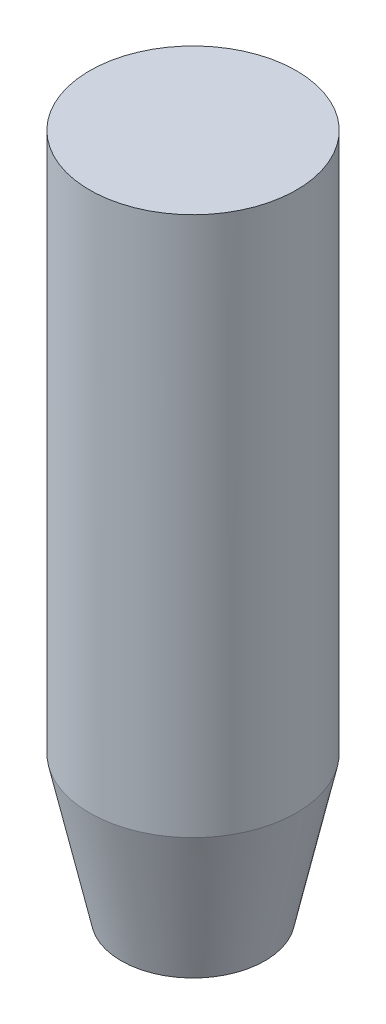
ISO-10303-21;
HEADER;
FILE_DESCRIPTION(('STEP AP214'),'2;1');
FILE_NAME('part.step','',(''),(''),'','','');
FILE_SCHEMA(('AUTOMOTIVE_DESIGN { 1 0 10303 214 1 1 1 1 }'));
ENDSEC;
DATA;
#1=APPLICATION_CONTEXT('core data for automotive mechanical design processes');
#2=APPLICATION_PROTOCOL_DEFINITION('international standard','automotive_design',2000,#1);
#3=PRODUCT_CONTEXT('',#1,'mechanical');
#4=PRODUCT('Part','Part','',(#3));
#5=PRODUCT_RELATED_PRODUCT_CATEGORY('part','',(#4));
#6=PRODUCT_DEFINITION_FORMATION('','',#4);
#7=PRODUCT_DEFINITION_CONTEXT('part definition',#1,'design');
#8=PRODUCT_DEFINITION('design','',#6,#7);
#9=PRODUCT_DEFINITION_SHAPE('','',#8);
#10=(LENGTH_UNIT() NAMED_UNIT(*) SI_UNIT(.MILLI.,.METRE.));
#11=(NAMED_UNIT(*) PLANE_ANGLE_UNIT() SI_UNIT($,.RADIAN.));
#12=(NAMED_UNIT(*) SI_UNIT($,.STERADIAN.) SOLID_ANGLE_UNIT());
#13=UNCERTAINTY_MEASURE_WITH_UNIT(LENGTH_MEASURE(1.E-05),#10,'distance_accuracy_value','');
#14=(GEOMETRIC_REPRESENTATION_CONTEXT(3) GLOBAL_UNCERTAINTY_ASSIGNED_CONTEXT((#13)) GLOBAL_UNIT_ASSIGNED_CONTEXT((#10,
#11,#12)) REPRESENTATION_CONTEXT('',''));
#15=CARTESIAN_POINT('',(0.,0.,0.));
#16=DIRECTION('',(0.,0.,1.));
#17=DIRECTION('',(1.,0.,0.));
#18=AXIS2_PLACEMENT_3D('',#15,#16,#17);
#19=CARTESIAN_POINT('',(0.,120.65,0.));
#20=DIRECTION('',(0.,-1.,0.));
#21=DIRECTION('',(0.,0.,-1.));
#22=AXIS2_PLACEMENT_3D('',#19,#20,#21);
#23=CYLINDRICAL_SURFACE('',#22,18.25625);
#24=CARTESIAN_POINT('',(0.,25.4000000000012,0.));
#25=DIRECTION('',(0.,1.,0.));
#26=DIRECTION('',(0.,0.,1.));
#27=AXIS2_PLACEMENT_3D('',#24,#25,#26);
#28=CIRCLE('',#27,18.25625);
#29=CARTESIAN_POINT('',(0.,25.4000000000012,-18.25625));
#30=VERTEX_POINT('',#29);
#31=EDGE_CURVE('E46',#30,#30,#28,.T.);
#32=CARTESIAN_POINT('',(0.,120.65,0.));
#33=DIRECTION('',(0.,1.,0.));
#34=DIRECTION('',(0.,0.,1.));
#35=AXIS2_PLACEMENT_3D('',#32,#33,#34);
#36=CIRCLE('',#35,18.25625);
#37=CARTESIAN_POINT('',(0.,120.65,-18.25625));
#38=VERTEX_POINT('',#37);
#39=EDGE_CURVE('E50',#38,#38,#36,.T.);
#40=CARTESIAN_POINT('',(0.,25.4000000000012,-18.25625));
#41=CARTESIAN_POINT('',(0.,26.3921875000012,-18.25625));
#42=CARTESIAN_POINT('',(0.,27.3843750000012,-18.25625));
#43=CARTESIAN_POINT('',(0.,29.3687500000012,-18.25625));
#44=CARTESIAN_POINT('',(0.,30.3609375000012,-18.25625));
#45=CARTESIAN_POINT('',(0.,32.3453125000011,-18.25625));
#46=CARTESIAN_POINT('',(0.,33.3375000000011,-18.25625));
#47=CARTESIAN_POINT('',(0.,35.3218750000011,-18.25625));
#48=CARTESIAN_POINT('',(0.,36.3140625000011,-18.25625));
#49=CARTESIAN_POINT('',(0.,38.2984375000011,-18.25625));
#50=CARTESIAN_POINT('',(0.,39.2906250000011,-18.25625));
#51=CARTESIAN_POINT('',(0.,41.275000000001,-18.25625));
#52=CARTESIAN_POINT('',(0.,42.267187500001,-18.25625));
#53=CARTESIAN_POINT('',(0.,44.251562500001,-18.25625));
#54=CARTESIAN_POINT('',(0.,45.243750000001,-18.25625));
#55=CARTESIAN_POINT('',(0.,47.2281250000009,-18.25625));
#56=CARTESIAN_POINT('',(0.,48.2203125000009,-18.25625));
#57=CARTESIAN_POINT('',(0.,50.2046875000009,-18.25625));
#58=CARTESIAN_POINT('',(0.,51.1968750000009,-18.25625));
#59=CARTESIAN_POINT('',(0.,53.1812500000009,-18.25625));
#60=CARTESIAN_POINT('',(0.,54.1734375000009,-18.25625));
#61=CARTESIAN_POINT('',(0.,56.1578125000008,-18.25625));
#62=CARTESIAN_POINT('',(0.,57.1500000000008,-18.25625));
#63=CARTESIAN_POINT('',(0.,59.1343750000008,-18.25625));
#64=CARTESIAN_POINT('',(0.,60.1265625000008,-18.25625));
#65=CARTESIAN_POINT('',(0.,62.1109375000007,-18.25625));
#66=CARTESIAN_POINT('',(0.,63.1031250000007,-18.25625));
#67=CARTESIAN_POINT('',(0.,65.0875000000007,-18.25625));
#68=CARTESIAN_POINT('',(0.,66.0796875000007,-18.25625));
#69=CARTESIAN_POINT('',(0.,68.0640625000007,-18.25625));
#70=CARTESIAN_POINT('',(0.,69.0562500000006,-18.25625));
#71=CARTESIAN_POINT('',(0.,71.0406250000006,-18.25625));
#72=CARTESIAN_POINT('',(0.,72.0328125000006,-18.25625));
#73=CARTESIAN_POINT('',(0.,74.0171875000006,-18.25625));
#74=CARTESIAN_POINT('',(0.,75.0093750000006,-18.25625));
#75=CARTESIAN_POINT('',(0.,76.9937500000006,-18.25625));
#76=CARTESIAN_POINT('',(0.,77.9859375000005,-18.25625));
#77=CARTESIAN_POINT('',(0.,79.9703125000005,-18.25625));
#78=CARTESIAN_POINT('',(0.,80.9625000000005,-18.25625));
#79=CARTESIAN_POINT('',(0.,82.9468750000005,-18.25625));
#80=CARTESIAN_POINT('',(0.,83.9390625000005,-18.25625));
#81=CARTESIAN_POINT('',(0.,85.9234375000004,-18.25625));
#82=CARTESIAN_POINT('',(0.,86.9156250000004,-18.25625));
#83=CARTESIAN_POINT('',(0.,88.9000000000004,-18.25625));
#84=CARTESIAN_POINT('',(0.,89.8921875000004,-18.25625));
#85=CARTESIAN_POINT('',(0.,91.8765625000004,-18.25625));
#86=CARTESIAN_POINT('',(0.,92.8687500000003,-18.25625));
#87=CARTESIAN_POINT('',(0.,94.8531250000003,-18.25625));
#88=CARTESIAN_POINT('',(0.,95.8453125000003,-18.25625));
#89=CARTESIAN_POINT('',(0.,97.8296875000003,-18.25625));
#90=CARTESIAN_POINT('',(0.,98.8218750000002,-18.25625));
#91=CARTESIAN_POINT('',(0.,100.80625,-18.25625));
#92=CARTESIAN_POINT('',(0.,101.7984375,-18.25625));
#93=CARTESIAN_POINT('',(0.,103.7828125,-18.25625));
#94=CARTESIAN_POINT('',(0.,104.775,-18.25625));
#95=CARTESIAN_POINT('',(0.,106.759375,-18.25625));
#96=CARTESIAN_POINT('',(0.,107.7515625,-18.25625));
#97=CARTESIAN_POINT('',(0.,109.7359375,-18.25625));
#98=CARTESIAN_POINT('',(0.,110.728125,-18.25625));
#99=CARTESIAN_POINT('',(0.,112.7125,-18.25625));
#100=CARTESIAN_POINT('',(0.,113.7046875,-18.25625));
#101=CARTESIAN_POINT('',(0.,115.6890625,-18.25625));
#102=CARTESIAN_POINT('',(0.,116.68125,-18.25625));
#103=CARTESIAN_POINT('',(0.,118.665625,-18.25625));
#104=CARTESIAN_POINT('',(0.,119.6578125,-18.25625));
#105=CARTESIAN_POINT('',(0.,120.65,-18.25625));
#106=B_SPLINE_CURVE_WITH_KNOTS('',3,(#40,#41,#42,#43,#44,#45,#46,#47,#48,#49,#50,#51,#52,#53,
#54,#55,#56,#57,#58,#59,#60,#61,#62,#63,#64,#65,#66,#67,#68,#69,#70,#71,#72,#73,#74,#75,#76,#77,
#78,#79,#80,#81,#82,#83,#84,#85,#86,#87,#88,#89,#90,#91,#92,#93,#94,#95,#96,#97,#98,#99,#100,
#101,#102,#103,#104,#105),.UNSPECIFIED.,.F.,.F.,(4,2,2,2,2,2,2,2,2,2,2,2,2,2,2,2,2,2,2,2,2,2,2,
2,2,2,2,2,2,2,2,2,4),(0.,2.97656249999996,5.95312499999992,8.92968749999988,11.9062499999998,
14.8828124999998,17.8593749999998,20.8359374999997,23.8124999999997,26.7890624999997,
29.7656249999996,32.7421874999996,35.7187499999995,38.6953124999995,41.6718749999995,
44.6484374999994,47.6249999999994,50.6015624999993,53.5781249999993,56.5546874999993,
59.5312499999992,62.5078124999992,65.4843749999991,68.4609374999991,71.4374999999991,
74.414062499999,77.390624999999,80.3671874999989,83.3437499999989,86.3203124999989,
89.2968749999988,92.2734374999988,95.2499999999987),.UNSPECIFIED.);
#107=EDGE_CURVE('BSEAM39',#30,#38,#106,.T.);
#108=ORIENTED_EDGE('',*,*,#31,.T.);
#109=ORIENTED_EDGE('',*,*,#39,.F.);
#110=ORIENTED_EDGE('',*,*,#107,.T.);
#111=ORIENTED_EDGE('',*,*,#107,.F.);
#112=EDGE_LOOP('',(#108,#110,#109,#111));
#113=FACE_BOUND('',#112,.T.);
#114=ADVANCED_FACE('F39',(#113),#23,.T.);
#115=CARTESIAN_POINT('',(0.,120.65,0.));
#116=DIRECTION('',(0.,1.,0.));
#117=DIRECTION('',(0.,0.,1.));
#118=AXIS2_PLACEMENT_3D('',#115,#116,#117);
#119=PLANE('',#118);
#120=ORIENTED_EDGE('',*,*,#39,.T.);
#121=EDGE_LOOP('',(#120));
#122=FACE_BOUND('',#121,.T.);
#123=ADVANCED_FACE('F57',(#122),#119,.T.);
#124=CARTESIAN_POINT('',(0.,0.,0.));
#125=DIRECTION('',(0.,1.,0.));
#126=DIRECTION('',(0.,0.,1.));
#127=AXIS2_PLACEMENT_3D('',#124,#125,#126);
#128=PLANE('',#127);
#129=CARTESIAN_POINT('',(0.,0.,0.));
#130=DIRECTION('',(0.,1.,0.));
#131=DIRECTION('',(0.,0.,1.));
#132=AXIS2_PLACEMENT_3D('',#129,#130,#131);
#133=CIRCLE('',#132,12.6999999999998);
#134=CARTESIAN_POINT('',(0.,0.,12.6999999999998));
#135=VERTEX_POINT('',#134);
#136=EDGE_CURVE('E10',#135,#135,#133,.F.);
#137=ORIENTED_EDGE('',*,*,#136,.T.);
#138=EDGE_LOOP('',(#137));
#139=FACE_BOUND('',#138,.T.);
#140=ADVANCED_FACE('F64',(#139),#128,.F.);
#141=CARTESIAN_POINT('',(0.,25.4000000000012,0.));
#142=DIRECTION('',(0.,1.,0.));
#143=DIRECTION('',(0.,0.,1.));
#144=AXIS2_PLACEMENT_3D('',#141,#142,#143);
#145=CONICAL_SURFACE('',#144,18.25625,0.215357699697737);
#146=ORIENTED_EDGE('',*,*,#136,.F.);
#147=EDGE_LOOP('',(#146));
#148=FACE_BOUND('',#147,.T.);
#149=ORIENTED_EDGE('',*,*,#31,.F.);
#150=EDGE_LOOP('',(#149));
#151=FACE_BOUND('',#150,.T.);
#152=ADVANCED_FACE('F41',(#148,#151),#145,.T.);
#153=CLOSED_SHELL('',(#114,#123,#140,#152));
#154=MANIFOLD_SOLID_BREP('B2',#153);
#155=ADVANCED_BREP_SHAPE_REPRESENTATION('',(#18,#154),#14);
#156=SHAPE_DEFINITION_REPRESENTATION(#9,#155);
ENDSEC;
END-ISO-10303-21;
